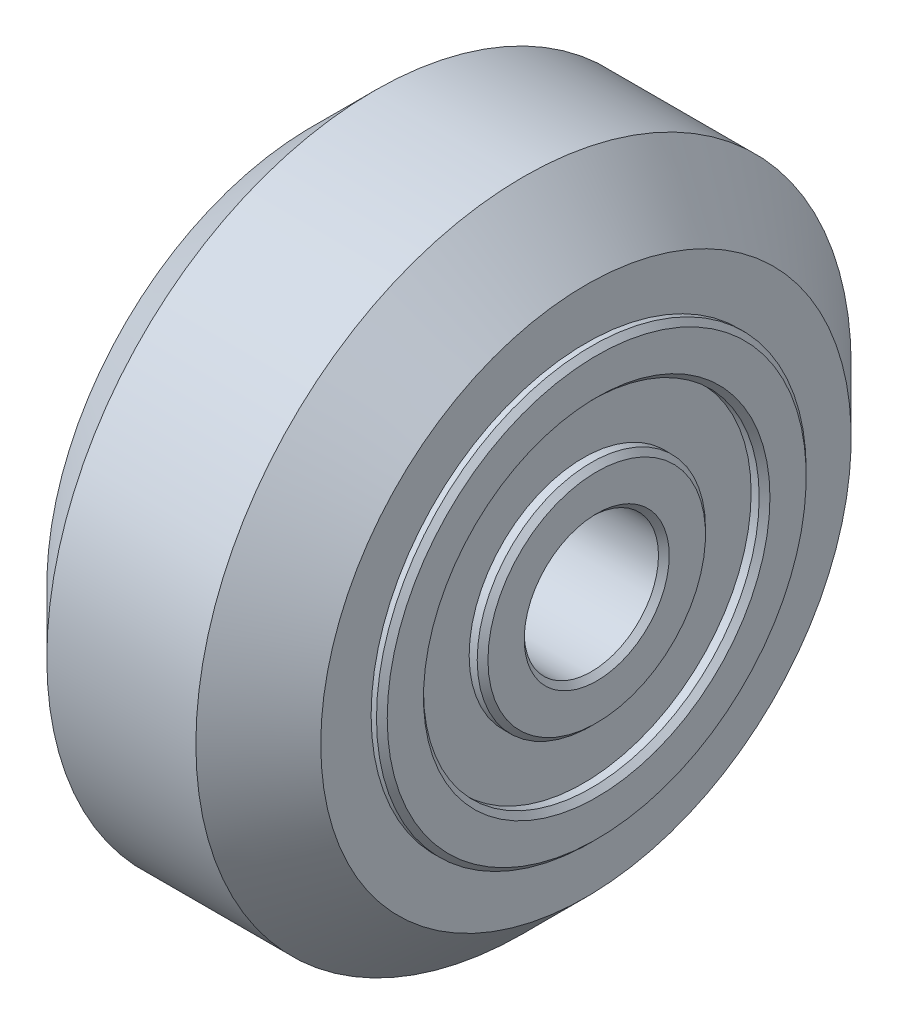
ISO-10303-21;
HEADER;
FILE_DESCRIPTION(('STEP AP214'),'2;1');
FILE_NAME('part.step','',(''),(''),'','','');
FILE_SCHEMA(('AUTOMOTIVE_DESIGN { 1 0 10303 214 1 1 1 1 }'));
ENDSEC;
DATA;
#1=APPLICATION_CONTEXT('core data for automotive mechanical design processes');
#2=APPLICATION_PROTOCOL_DEFINITION('international standard','automotive_design',2000,#1);
#3=PRODUCT_CONTEXT('',#1,'mechanical');
#4=PRODUCT('Part','Part','',(#3));
#5=PRODUCT_RELATED_PRODUCT_CATEGORY('part','',(#4));
#6=PRODUCT_DEFINITION_FORMATION('','',#4);
#7=PRODUCT_DEFINITION_CONTEXT('part definition',#1,'design');
#8=PRODUCT_DEFINITION('design','',#6,#7);
#9=PRODUCT_DEFINITION_SHAPE('','',#8);
#10=(LENGTH_UNIT() NAMED_UNIT(*) SI_UNIT(.MILLI.,.METRE.));
#11=(NAMED_UNIT(*) PLANE_ANGLE_UNIT() SI_UNIT($,.RADIAN.));
#12=(NAMED_UNIT(*) SI_UNIT($,.STERADIAN.) SOLID_ANGLE_UNIT());
#13=UNCERTAINTY_MEASURE_WITH_UNIT(LENGTH_MEASURE(1.E-05),#10,'distance_accuracy_value','');
#14=(GEOMETRIC_REPRESENTATION_CONTEXT(3) GLOBAL_UNCERTAINTY_ASSIGNED_CONTEXT((#13)) GLOBAL_UNIT_ASSIGNED_CONTEXT((#10,
#11,#12)) REPRESENTATION_CONTEXT('',''));
#15=CARTESIAN_POINT('',(0.,0.,0.));
#16=DIRECTION('',(0.,0.,1.));
#17=DIRECTION('',(1.,0.,0.));
#18=AXIS2_PLACEMENT_3D('',#15,#16,#17);
#19=CARTESIAN_POINT('',(0.,0.,0.));
#20=DIRECTION('',(1.,0.,0.));
#21=DIRECTION('',(0.,0.,-1.));
#22=AXIS2_PLACEMENT_3D('',#19,#20,#21);
#23=CYLINDRICAL_SURFACE('',#22,2.5);
#24=CARTESIAN_POINT('',(5.30000000003383,0.,0.));
#25=DIRECTION('',(1.,0.,0.));
#26=DIRECTION('',(0.,0.,-1.));
#27=AXIS2_PLACEMENT_3D('',#24,#25,#26);
#28=CIRCLE('',#27,2.49999999999773);
#29=CARTESIAN_POINT('',(5.30000000003383,0.,-2.49999999999773));
#30=VERTEX_POINT('',#29);
#31=EDGE_CURVE('P0_E52',#30,#30,#28,.T.);
#32=ORIENTED_EDGE('',*,*,#31,.T.);
#33=EDGE_LOOP('',(#32));
#34=FACE_BOUND('',#33,.T.);
#35=CARTESIAN_POINT('',(-5.29999999997699,0.,0.));
#36=DIRECTION('',(-1.,0.,0.));
#37=DIRECTION('',(0.,0.,1.));
#38=AXIS2_PLACEMENT_3D('',#35,#36,#37);
#39=CIRCLE('',#38,2.49999999999773);
#40=CARTESIAN_POINT('',(-5.29999999997699,0.,2.49999999999773));
#41=VERTEX_POINT('',#40);
#42=EDGE_CURVE('P0_E49',#41,#41,#39,.T.);
#43=ORIENTED_EDGE('',*,*,#42,.T.);
#44=EDGE_LOOP('',(#43));
#45=FACE_BOUND('',#44,.T.);
#46=ADVANCED_FACE('P0_F14',(#34,#45),#23,.F.);
#47=CARTESIAN_POINT('',(5.49999999998363,0.,0.));
#48=DIRECTION('',(1.,0.,0.));
#49=DIRECTION('',(0.,0.,-1.));
#50=AXIS2_PLACEMENT_3D('',#47,#48,#49);
#51=CONICAL_SURFACE('',#50,2.69999999994752,0.785398163397448);
#52=CARTESIAN_POINT('',(5.49999999998363,0.,0.));
#53=DIRECTION('',(1.,0.,0.));
#54=DIRECTION('',(0.,0.,-1.));
#55=AXIS2_PLACEMENT_3D('',#52,#53,#54);
#56=CIRCLE('',#55,2.69999999994752);
#57=CARTESIAN_POINT('',(5.49999999998363,0.,-2.69999999994752));
#58=VERTEX_POINT('',#57);
#59=EDGE_CURVE('P0_E17',#58,#58,#56,.F.);
#60=ORIENTED_EDGE('',*,*,#59,.F.);
#61=EDGE_LOOP('',(#60));
#62=FACE_BOUND('',#61,.T.);
#63=ORIENTED_EDGE('',*,*,#31,.F.);
#64=EDGE_LOOP('',(#63));
#65=FACE_BOUND('',#64,.T.);
#66=ADVANCED_FACE('P0_F89',(#62,#65),#51,.F.);
#67=CARTESIAN_POINT('',(-5.49999999992679,0.,0.));
#68=DIRECTION('',(-1.,0.,0.));
#69=DIRECTION('',(0.,0.,1.));
#70=AXIS2_PLACEMENT_3D('',#67,#68,#69);
#71=CONICAL_SURFACE('',#70,2.70000000000437,0.785398163539557);
#72=CARTESIAN_POINT('',(-5.49999999992679,0.,0.));
#73=DIRECTION('',(-1.,0.,0.));
#74=DIRECTION('',(0.,0.,1.));
#75=AXIS2_PLACEMENT_3D('',#72,#73,#74);
#76=CIRCLE('',#75,2.70000000000437);
#77=CARTESIAN_POINT('',(-5.49999999992679,0.,2.70000000000437));
#78=VERTEX_POINT('',#77);
#79=EDGE_CURVE('P0_E79',#78,#78,#76,.F.);
#80=ORIENTED_EDGE('',*,*,#79,.F.);
#81=EDGE_LOOP('',(#80));
#82=FACE_BOUND('',#81,.T.);
#83=ORIENTED_EDGE('',*,*,#42,.F.);
#84=EDGE_LOOP('',(#83));
#85=FACE_BOUND('',#84,.T.);
#86=ADVANCED_FACE('P0_F92',(#82,#85),#71,.F.);
#87=CARTESIAN_POINT('',(5.5,2.5,0.));
#88=DIRECTION('',(1.,0.,0.));
#89=DIRECTION('',(0.,0.,-1.));
#90=AXIS2_PLACEMENT_3D('',#87,#88,#89);
#91=PLANE('',#90);
#92=ORIENTED_EDGE('',*,*,#59,.T.);
#93=EDGE_LOOP('',(#92));
#94=FACE_BOUND('',#93,.T.);
#95=CARTESIAN_POINT('',(5.49999999998363,0.,0.));
#96=DIRECTION('',(-1.,0.,0.));
#97=DIRECTION('',(0.,0.,1.));
#98=AXIS2_PLACEMENT_3D('',#95,#96,#97);
#99=CIRCLE('',#98,4.05000000000655);
#100=CARTESIAN_POINT('',(5.49999999998363,0.,4.05000000000655));
#101=VERTEX_POINT('',#100);
#102=EDGE_CURVE('P0_E77',#101,#101,#99,.T.);
#103=ORIENTED_EDGE('',*,*,#102,.F.);
#104=EDGE_LOOP('',(#103));
#105=FACE_BOUND('',#104,.T.);
#106=ADVANCED_FACE('P0_F86',(#94,#105),#91,.T.);
#107=CARTESIAN_POINT('',(-5.5,2.5,0.));
#108=DIRECTION('',(-1.,0.,0.));
#109=DIRECTION('',(0.,0.,1.));
#110=AXIS2_PLACEMENT_3D('',#107,#108,#109);
#111=PLANE('',#110);
#112=ORIENTED_EDGE('',*,*,#79,.T.);
#113=EDGE_LOOP('',(#112));
#114=FACE_BOUND('',#113,.T.);
#115=CARTESIAN_POINT('',(-5.50000000004047,0.,0.));
#116=DIRECTION('',(1.,0.,0.));
#117=DIRECTION('',(0.,0.,-1.));
#118=AXIS2_PLACEMENT_3D('',#115,#116,#117);
#119=CIRCLE('',#118,4.05000000000655);
#120=CARTESIAN_POINT('',(-5.50000000004047,0.,-4.05000000000655));
#121=VERTEX_POINT('',#120);
#122=EDGE_CURVE('P0_E46',#121,#121,#119,.T.);
#123=ORIENTED_EDGE('',*,*,#122,.F.);
#124=EDGE_LOOP('',(#123));
#125=FACE_BOUND('',#124,.T.);
#126=ADVANCED_FACE('P0_F106',(#114,#125),#111,.T.);
#127=CARTESIAN_POINT('',(5.30000000009068,0.,0.));
#128=DIRECTION('',(-1.,0.,0.));
#129=DIRECTION('',(0.,0.,1.));
#130=AXIS2_PLACEMENT_3D('',#127,#128,#129);
#131=CONICAL_SURFACE('',#130,4.24999999995634,0.785398163539557);
#132=ORIENTED_EDGE('',*,*,#102,.T.);
#133=EDGE_LOOP('',(#132));
#134=FACE_BOUND('',#133,.T.);
#135=CARTESIAN_POINT('',(5.3,0.,0.));
#136=DIRECTION('',(1.,0.,0.));
#137=DIRECTION('',(0.,0.,-1.));
#138=AXIS2_PLACEMENT_3D('',#135,#136,#137);
#139=CIRCLE('',#138,4.25);
#140=CARTESIAN_POINT('',(5.3,0.,-4.25));
#141=VERTEX_POINT('',#140);
#142=EDGE_CURVE('P0_E43',#141,#141,#139,.F.);
#143=ORIENTED_EDGE('',*,*,#142,.F.);
#144=EDGE_LOOP('',(#143));
#145=FACE_BOUND('',#144,.T.);
#146=ADVANCED_FACE('P0_F166',(#134,#145),#131,.T.);
#147=CARTESIAN_POINT('',(-5.29999999997699,0.,0.));
#148=DIRECTION('',(1.,0.,0.));
#149=DIRECTION('',(0.,0.,-1.));
#150=AXIS2_PLACEMENT_3D('',#147,#148,#149);
#151=CONICAL_SURFACE('',#150,4.25000000007003,0.785398163397448);
#152=ORIENTED_EDGE('',*,*,#122,.T.);
#153=EDGE_LOOP('',(#152));
#154=FACE_BOUND('',#153,.T.);
#155=CARTESIAN_POINT('',(-5.3,0.,0.));
#156=DIRECTION('',(1.,0.,0.));
#157=DIRECTION('',(0.,0.,-1.));
#158=AXIS2_PLACEMENT_3D('',#155,#156,#157);
#159=CIRCLE('',#158,4.25);
#160=CARTESIAN_POINT('',(-5.3,0.,-4.25));
#161=VERTEX_POINT('',#160);
#162=EDGE_CURVE('P0_E39',#161,#161,#159,.T.);
#163=ORIENTED_EDGE('',*,*,#162,.F.);
#164=EDGE_LOOP('',(#163));
#165=FACE_BOUND('',#164,.T.);
#166=ADVANCED_FACE('P0_F162',(#154,#165),#151,.T.);
#167=CARTESIAN_POINT('',(0.,0.,0.));
#168=DIRECTION('',(1.,0.,0.));
#169=DIRECTION('',(0.,0.,-1.));
#170=AXIS2_PLACEMENT_3D('',#167,#168,#169);
#171=CYLINDRICAL_SURFACE('',#170,4.25);
#172=CARTESIAN_POINT('',(5.,0.,0.));
#173=DIRECTION('',(1.,0.,0.));
#174=DIRECTION('',(0.,0.,-1.));
#175=AXIS2_PLACEMENT_3D('',#172,#173,#174);
#176=CIRCLE('',#175,4.25);
#177=CARTESIAN_POINT('',(5.,0.,-4.25));
#178=VERTEX_POINT('',#177);
#179=EDGE_CURVE('P0_E42',#178,#178,#176,.F.);
#180=ORIENTED_EDGE('',*,*,#179,.F.);
#181=EDGE_LOOP('',(#180));
#182=FACE_BOUND('',#181,.T.);
#183=ORIENTED_EDGE('',*,*,#142,.T.);
#184=EDGE_LOOP('',(#183));
#185=FACE_BOUND('',#184,.T.);
#186=ADVANCED_FACE('P0_F158',(#182,#185),#171,.T.);
#187=CARTESIAN_POINT('',(0.,0.,0.));
#188=DIRECTION('',(1.,0.,0.));
#189=DIRECTION('',(0.,0.,-1.));
#190=AXIS2_PLACEMENT_3D('',#187,#188,#189);
#191=CYLINDRICAL_SURFACE('',#190,4.25);
#192=ORIENTED_EDGE('',*,*,#162,.T.);
#193=EDGE_LOOP('',(#192));
#194=FACE_BOUND('',#193,.T.);
#195=CARTESIAN_POINT('',(-5.,0.,0.));
#196=DIRECTION('',(1.,0.,0.));
#197=DIRECTION('',(0.,0.,-1.));
#198=AXIS2_PLACEMENT_3D('',#195,#196,#197);
#199=CIRCLE('',#198,4.25);
#200=CARTESIAN_POINT('',(-5.,0.,-4.25));
#201=VERTEX_POINT('',#200);
#202=EDGE_CURVE('P0_E70',#201,#201,#199,.T.);
#203=ORIENTED_EDGE('',*,*,#202,.F.);
#204=EDGE_LOOP('',(#203));
#205=FACE_BOUND('',#204,.T.);
#206=ADVANCED_FACE('P0_F154',(#194,#205),#191,.T.);
#207=CARTESIAN_POINT('',(5.,4.25,0.));
#208=DIRECTION('',(1.,0.,0.));
#209=DIRECTION('',(0.,0.,-1.));
#210=AXIS2_PLACEMENT_3D('',#207,#208,#209);
#211=PLANE('',#210);
#212=ORIENTED_EDGE('',*,*,#179,.T.);
#213=EDGE_LOOP('',(#212));
#214=FACE_BOUND('',#213,.T.);
#215=CARTESIAN_POINT('',(5.,0.,0.));
#216=DIRECTION('',(1.,0.,0.));
#217=DIRECTION('',(0.,0.,-1.));
#218=AXIS2_PLACEMENT_3D('',#215,#216,#217);
#219=CIRCLE('',#218,6.25);
#220=CARTESIAN_POINT('',(5.,0.,-6.25));
#221=VERTEX_POINT('',#220);
#222=EDGE_CURVE('P0_E67',#221,#221,#219,.T.);
#223=ORIENTED_EDGE('',*,*,#222,.T.);
#224=EDGE_LOOP('',(#223));
#225=FACE_BOUND('',#224,.T.);
#226=ADVANCED_FACE('P0_F150',(#214,#225),#211,.T.);
#227=CARTESIAN_POINT('',(-5.,4.25,0.));
#228=DIRECTION('',(-1.,0.,0.));
#229=DIRECTION('',(0.,0.,1.));
#230=AXIS2_PLACEMENT_3D('',#227,#228,#229);
#231=PLANE('',#230);
#232=ORIENTED_EDGE('',*,*,#202,.T.);
#233=EDGE_LOOP('',(#232));
#234=FACE_BOUND('',#233,.T.);
#235=CARTESIAN_POINT('',(-5.,0.,0.));
#236=DIRECTION('',(1.,0.,0.));
#237=DIRECTION('',(0.,0.,-1.));
#238=AXIS2_PLACEMENT_3D('',#235,#236,#237);
#239=CIRCLE('',#238,6.25);
#240=CARTESIAN_POINT('',(-5.,0.,-6.25));
#241=VERTEX_POINT('',#240);
#242=EDGE_CURVE('P0_E38',#241,#241,#239,.F.);
#243=ORIENTED_EDGE('',*,*,#242,.T.);
#244=EDGE_LOOP('',(#243));
#245=FACE_BOUND('',#244,.T.);
#246=ADVANCED_FACE('P0_F146',(#234,#245),#231,.T.);
#247=CARTESIAN_POINT('',(0.,0.,0.));
#248=DIRECTION('',(1.,0.,0.));
#249=DIRECTION('',(0.,0.,-1.));
#250=AXIS2_PLACEMENT_3D('',#247,#248,#249);
#251=CYLINDRICAL_SURFACE('',#250,6.25);
#252=CARTESIAN_POINT('',(5.29999999992015,0.,0.));
#253=DIRECTION('',(1.,0.,0.));
#254=DIRECTION('',(0.,0.,-1.));
#255=AXIS2_PLACEMENT_3D('',#252,#253,#254);
#256=CIRCLE('',#255,6.25000000002274);
#257=CARTESIAN_POINT('',(5.29999999992015,0.,-6.25000000002274));
#258=VERTEX_POINT('',#257);
#259=EDGE_CURVE('P0_E35',#258,#258,#256,.T.);
#260=ORIENTED_EDGE('',*,*,#259,.T.);
#261=EDGE_LOOP('',(#260));
#262=FACE_BOUND('',#261,.T.);
#263=ORIENTED_EDGE('',*,*,#222,.F.);
#264=EDGE_LOOP('',(#263));
#265=FACE_BOUND('',#264,.T.);
#266=ADVANCED_FACE('P0_F142',(#262,#265),#251,.F.);
#267=CARTESIAN_POINT('',(0.,0.,0.));
#268=DIRECTION('',(1.,0.,0.));
#269=DIRECTION('',(0.,0.,-1.));
#270=AXIS2_PLACEMENT_3D('',#267,#268,#269);
#271=CYLINDRICAL_SURFACE('',#270,6.25);
#272=ORIENTED_EDGE('',*,*,#242,.F.);
#273=EDGE_LOOP('',(#272));
#274=FACE_BOUND('',#273,.T.);
#275=CARTESIAN_POINT('',(-5.30000000003383,0.,0.));
#276=DIRECTION('',(-1.,0.,0.));
#277=DIRECTION('',(0.,0.,1.));
#278=AXIS2_PLACEMENT_3D('',#275,#276,#277);
#279=CIRCLE('',#278,6.25000000002274);
#280=CARTESIAN_POINT('',(-5.30000000003383,0.,6.25000000002274));
#281=VERTEX_POINT('',#280);
#282=EDGE_CURVE('P0_E31',#281,#281,#279,.T.);
#283=ORIENTED_EDGE('',*,*,#282,.T.);
#284=EDGE_LOOP('',(#283));
#285=FACE_BOUND('',#284,.T.);
#286=ADVANCED_FACE('P0_F138',(#274,#285),#271,.F.);
#287=CARTESIAN_POINT('',(5.49999999998363,0.,0.));
#288=DIRECTION('',(1.,0.,0.));
#289=DIRECTION('',(0.,0.,-1.));
#290=AXIS2_PLACEMENT_3D('',#287,#288,#289);
#291=CONICAL_SURFACE('',#290,6.45000000008622,0.785398163397448);
#292=CARTESIAN_POINT('',(5.49999999998363,0.,0.));
#293=DIRECTION('',(1.,0.,0.));
#294=DIRECTION('',(0.,0.,-1.));
#295=AXIS2_PLACEMENT_3D('',#292,#293,#294);
#296=CIRCLE('',#295,6.45000000008622);
#297=CARTESIAN_POINT('',(5.49999999998363,0.,-6.45000000008622));
#298=VERTEX_POINT('',#297);
#299=EDGE_CURVE('P0_E34',#298,#298,#296,.F.);
#300=ORIENTED_EDGE('',*,*,#299,.F.);
#301=EDGE_LOOP('',(#300));
#302=FACE_BOUND('',#301,.T.);
#303=ORIENTED_EDGE('',*,*,#259,.F.);
#304=EDGE_LOOP('',(#303));
#305=FACE_BOUND('',#304,.T.);
#306=ADVANCED_FACE('P0_F134',(#302,#305),#291,.F.);
#307=CARTESIAN_POINT('',(-5.49999999992679,0.,0.));
#308=DIRECTION('',(-1.,0.,0.));
#309=DIRECTION('',(0.,0.,1.));
#310=AXIS2_PLACEMENT_3D('',#307,#308,#309);
#311=CONICAL_SURFACE('',#310,6.44999999985885,0.785398163397448);
#312=CARTESIAN_POINT('',(-5.49999999998363,0.,0.));
#313=DIRECTION('',(-1.,0.,0.));
#314=DIRECTION('',(0.,0.,1.));
#315=AXIS2_PLACEMENT_3D('',#312,#313,#314);
#316=CIRCLE('',#315,6.44999999991569);
#317=CARTESIAN_POINT('',(-5.49999999998363,0.,6.44999999991569));
#318=VERTEX_POINT('',#317);
#319=EDGE_CURVE('P0_E60',#318,#318,#316,.F.);
#320=ORIENTED_EDGE('',*,*,#319,.F.);
#321=EDGE_LOOP('',(#320));
#322=FACE_BOUND('',#321,.T.);
#323=ORIENTED_EDGE('',*,*,#282,.F.);
#324=EDGE_LOOP('',(#323));
#325=FACE_BOUND('',#324,.T.);
#326=ADVANCED_FACE('P0_F130',(#322,#325),#311,.F.);
#327=CARTESIAN_POINT('',(5.5,6.25,0.));
#328=DIRECTION('',(1.,0.,0.));
#329=DIRECTION('',(0.,0.,-1.));
#330=AXIS2_PLACEMENT_3D('',#327,#328,#329);
#331=PLANE('',#330);
#332=ORIENTED_EDGE('',*,*,#299,.T.);
#333=EDGE_LOOP('',(#332));
#334=FACE_BOUND('',#333,.T.);
#335=CARTESIAN_POINT('',(5.5,0.,0.));
#336=DIRECTION('',(-1.,0.,0.));
#337=DIRECTION('',(0.,0.,1.));
#338=AXIS2_PLACEMENT_3D('',#335,#336,#337);
#339=CIRCLE('',#338,7.8);
#340=CARTESIAN_POINT('',(5.5,0.,7.8));
#341=VERTEX_POINT('',#340);
#342=EDGE_CURVE('P0_E57',#341,#341,#339,.T.);
#343=ORIENTED_EDGE('',*,*,#342,.F.);
#344=EDGE_LOOP('',(#343));
#345=FACE_BOUND('',#344,.T.);
#346=ADVANCED_FACE('P0_F126',(#334,#345),#331,.T.);
#347=CARTESIAN_POINT('',(-5.5,6.25,0.));
#348=DIRECTION('',(-1.,0.,0.));
#349=DIRECTION('',(0.,0.,1.));
#350=AXIS2_PLACEMENT_3D('',#347,#348,#349);
#351=PLANE('',#350);
#352=ORIENTED_EDGE('',*,*,#319,.T.);
#353=EDGE_LOOP('',(#352));
#354=FACE_BOUND('',#353,.T.);
#355=CARTESIAN_POINT('',(-5.5,0.,0.));
#356=DIRECTION('',(1.,0.,0.));
#357=DIRECTION('',(0.,0.,-1.));
#358=AXIS2_PLACEMENT_3D('',#355,#356,#357);
#359=CIRCLE('',#358,7.8);
#360=CARTESIAN_POINT('',(-5.5,0.,-7.8));
#361=VERTEX_POINT('',#360);
#362=EDGE_CURVE('P0_E26',#361,#361,#359,.T.);
#363=ORIENTED_EDGE('',*,*,#362,.F.);
#364=EDGE_LOOP('',(#363));
#365=FACE_BOUND('',#364,.T.);
#366=ADVANCED_FACE('P0_F122',(#354,#365),#351,.T.);
#367=CARTESIAN_POINT('',(5.3,0.,0.));
#368=DIRECTION('',(-1.,0.,0.));
#369=DIRECTION('',(0.,0.,1.));
#370=AXIS2_PLACEMENT_3D('',#367,#368,#369);
#371=CONICAL_SURFACE('',#370,8.,0.785398163397457);
#372=ORIENTED_EDGE('',*,*,#342,.T.);
#373=EDGE_LOOP('',(#372));
#374=FACE_BOUND('',#373,.T.);
#375=CARTESIAN_POINT('',(5.3,0.,0.));
#376=DIRECTION('',(1.,0.,0.));
#377=DIRECTION('',(0.,0.,-1.));
#378=AXIS2_PLACEMENT_3D('',#375,#376,#377);
#379=CIRCLE('',#378,8.);
#380=CARTESIAN_POINT('',(5.3,0.,-8.));
#381=VERTEX_POINT('',#380);
#382=EDGE_CURVE('P0_E21',#381,#381,#379,.F.);
#383=ORIENTED_EDGE('',*,*,#382,.F.);
#384=EDGE_LOOP('',(#383));
#385=FACE_BOUND('',#384,.T.);
#386=ADVANCED_FACE('P0_F115',(#374,#385),#371,.T.);
#387=CARTESIAN_POINT('',(-5.3,0.,0.));
#388=DIRECTION('',(1.,0.,0.));
#389=DIRECTION('',(0.,0.,-1.));
#390=AXIS2_PLACEMENT_3D('',#387,#388,#389);
#391=CONICAL_SURFACE('',#390,8.,0.785398163397459);
#392=ORIENTED_EDGE('',*,*,#362,.T.);
#393=EDGE_LOOP('',(#392));
#394=FACE_BOUND('',#393,.T.);
#395=CARTESIAN_POINT('',(-5.3,0.,0.));
#396=DIRECTION('',(1.,0.,0.));
#397=DIRECTION('',(0.,0.,-1.));
#398=AXIS2_PLACEMENT_3D('',#395,#396,#397);
#399=CIRCLE('',#398,8.);
#400=CARTESIAN_POINT('',(-5.3,0.,-8.));
#401=VERTEX_POINT('',#400);
#402=EDGE_CURVE('P0_E9',#401,#401,#399,.T.);
#403=ORIENTED_EDGE('',*,*,#402,.F.);
#404=EDGE_LOOP('',(#403));
#405=FACE_BOUND('',#404,.T.);
#406=ADVANCED_FACE('P0_F110',(#394,#405),#391,.T.);
#407=CARTESIAN_POINT('',(0.,0.,0.));
#408=DIRECTION('',(1.,0.,0.));
#409=DIRECTION('',(0.,0.,-1.));
#410=AXIS2_PLACEMENT_3D('',#407,#408,#409);
#411=CYLINDRICAL_SURFACE('',#410,8.);
#412=ORIENTED_EDGE('',*,*,#402,.T.);
#413=EDGE_LOOP('',(#412));
#414=FACE_BOUND('',#413,.T.);
#415=ORIENTED_EDGE('',*,*,#382,.T.);
#416=EDGE_LOOP('',(#415));
#417=FACE_BOUND('',#416,.T.);
#418=ADVANCED_FACE('P0_F108',(#414,#417),#411,.T.);
#419=CLOSED_SHELL('',(#46,#66,#86,#106,#126,#146,#166,#186,#206,#226,#246,#266,#286,#306,#326,
#346,#366,#386,#406,#418));
#420=MANIFOLD_SOLID_BREP('P0_B1',#419);
#421=CARTESIAN_POINT('',(0.,0.,0.));
#422=DIRECTION('',(-1.,0.,0.));
#423=DIRECTION('',(0.,0.,1.));
#424=AXIS2_PLACEMENT_3D('',#421,#422,#423);
#425=CYLINDRICAL_SURFACE('',#424,12.2);
#426=CARTESIAN_POINT('',(2.775,0.,0.));
#427=DIRECTION('',(-1.,0.,0.));
#428=DIRECTION('',(0.,0.,1.));
#429=AXIS2_PLACEMENT_3D('',#426,#427,#428);
#430=CIRCLE('',#429,12.2);
#431=CARTESIAN_POINT('',(2.775,0.,12.2));
#432=VERTEX_POINT('',#431);
#433=EDGE_CURVE('P1_E35',#432,#432,#430,.F.);
#434=ORIENTED_EDGE('',*,*,#433,.F.);
#435=EDGE_LOOP('',(#434));
#436=FACE_BOUND('',#435,.T.);
#437=CARTESIAN_POINT('',(-2.775,0.,0.));
#438=DIRECTION('',(1.,0.,0.));
#439=DIRECTION('',(0.,0.,-1.));
#440=AXIS2_PLACEMENT_3D('',#437,#438,#439);
#441=CIRCLE('',#440,12.2);
#442=CARTESIAN_POINT('',(-2.775,0.,-12.2));
#443=VERTEX_POINT('',#442);
#444=EDGE_CURVE('P1_E29',#443,#443,#441,.F.);
#445=ORIENTED_EDGE('',*,*,#444,.F.);
#446=EDGE_LOOP('',(#445));
#447=FACE_BOUND('',#446,.T.);
#448=ADVANCED_FACE('P1_F14',(#436,#447),#425,.T.);
#449=CARTESIAN_POINT('',(-2.775,0.,0.));
#450=DIRECTION('',(1.,0.,0.));
#451=DIRECTION('',(0.,0.,-1.));
#452=AXIS2_PLACEMENT_3D('',#449,#450,#451);
#453=CONICAL_SURFACE('',#452,12.2,0.78539816339745);
#454=CARTESIAN_POINT('',(-5.1,0.,0.));
#455=DIRECTION('',(1.,0.,0.));
#456=DIRECTION('',(0.,0.,-1.));
#457=AXIS2_PLACEMENT_3D('',#454,#455,#456);
#458=CIRCLE('',#457,9.87499999999999);
#459=CARTESIAN_POINT('',(-5.1,0.,-9.87499999999999));
#460=VERTEX_POINT('',#459);
#461=EDGE_CURVE('P1_E17',#460,#460,#458,.T.);
#462=ORIENTED_EDGE('',*,*,#461,.T.);
#463=EDGE_LOOP('',(#462));
#464=FACE_BOUND('',#463,.T.);
#465=ORIENTED_EDGE('',*,*,#444,.T.);
#466=EDGE_LOOP('',(#465));
#467=FACE_BOUND('',#466,.T.);
#468=ADVANCED_FACE('P1_F44',(#464,#467),#453,.T.);
#469=CARTESIAN_POINT('',(2.775,0.,0.));
#470=DIRECTION('',(-1.,0.,0.));
#471=DIRECTION('',(0.,0.,1.));
#472=AXIS2_PLACEMENT_3D('',#469,#470,#471);
#473=CONICAL_SURFACE('',#472,12.2,0.785398163397449);
#474=CARTESIAN_POINT('',(5.1,0.,0.));
#475=DIRECTION('',(-1.,0.,0.));
#476=DIRECTION('',(0.,0.,1.));
#477=AXIS2_PLACEMENT_3D('',#474,#475,#476);
#478=CIRCLE('',#477,9.87499999999999);
#479=CARTESIAN_POINT('',(5.1,0.,9.87499999999999));
#480=VERTEX_POINT('',#479);
#481=EDGE_CURVE('P1_E26',#480,#480,#478,.F.);
#482=ORIENTED_EDGE('',*,*,#481,.F.);
#483=EDGE_LOOP('',(#482));
#484=FACE_BOUND('',#483,.T.);
#485=ORIENTED_EDGE('',*,*,#433,.T.);
#486=EDGE_LOOP('',(#485));
#487=FACE_BOUND('',#486,.T.);
#488=ADVANCED_FACE('P1_F52',(#484,#487),#473,.T.);
#489=CARTESIAN_POINT('',(-5.1,0.,0.));
#490=DIRECTION('',(1.,0.,0.));
#491=DIRECTION('',(0.,0.,-1.));
#492=AXIS2_PLACEMENT_3D('',#489,#490,#491);
#493=PLANE('',#492);
#494=CARTESIAN_POINT('',(-5.1,0.,0.));
#495=DIRECTION('',(-1.,0.,0.));
#496=DIRECTION('',(0.,0.,1.));
#497=AXIS2_PLACEMENT_3D('',#494,#495,#496);
#498=CIRCLE('',#497,8.);
#499=CARTESIAN_POINT('',(-5.1,0.,8.));
#500=VERTEX_POINT('',#499);
#501=EDGE_CURVE('P1_E21',#500,#500,#498,.F.);
#502=ORIENTED_EDGE('',*,*,#501,.T.);
#503=EDGE_LOOP('',(#502));
#504=FACE_BOUND('',#503,.T.);
#505=ORIENTED_EDGE('',*,*,#461,.F.);
#506=EDGE_LOOP('',(#505));
#507=FACE_BOUND('',#506,.T.);
#508=ADVANCED_FACE('P1_F61',(#504,#507),#493,.F.);
#509=CARTESIAN_POINT('',(5.1,0.,0.));
#510=DIRECTION('',(1.,0.,0.));
#511=DIRECTION('',(0.,0.,-1.));
#512=AXIS2_PLACEMENT_3D('',#509,#510,#511);
#513=PLANE('',#512);
#514=CARTESIAN_POINT('',(5.1,0.,0.));
#515=DIRECTION('',(-1.,0.,0.));
#516=DIRECTION('',(0.,0.,1.));
#517=AXIS2_PLACEMENT_3D('',#514,#515,#516);
#518=CIRCLE('',#517,8.);
#519=CARTESIAN_POINT('',(5.1,0.,8.));
#520=VERTEX_POINT('',#519);
#521=EDGE_CURVE('P1_E9',#520,#520,#518,.T.);
#522=ORIENTED_EDGE('',*,*,#521,.T.);
#523=EDGE_LOOP('',(#522));
#524=FACE_BOUND('',#523,.T.);
#525=ORIENTED_EDGE('',*,*,#481,.T.);
#526=EDGE_LOOP('',(#525));
#527=FACE_BOUND('',#526,.T.);
#528=ADVANCED_FACE('P1_F55',(#524,#527),#513,.T.);
#529=CARTESIAN_POINT('',(0.,0.,0.));
#530=DIRECTION('',(-1.,0.,0.));
#531=DIRECTION('',(0.,0.,1.));
#532=AXIS2_PLACEMENT_3D('',#529,#530,#531);
#533=CYLINDRICAL_SURFACE('',#532,8.);
#534=ORIENTED_EDGE('',*,*,#501,.F.);
#535=EDGE_LOOP('',(#534));
#536=FACE_BOUND('',#535,.T.);
#537=ORIENTED_EDGE('',*,*,#521,.F.);
#538=EDGE_LOOP('',(#537));
#539=FACE_BOUND('',#538,.T.);
#540=ADVANCED_FACE('P1_F53',(#536,#539),#533,.F.);
#541=CLOSED_SHELL('',(#448,#468,#488,#508,#528,#540));
#542=MANIFOLD_SOLID_BREP('P1_B1',#541);
#543=ADVANCED_BREP_SHAPE_REPRESENTATION('',(#18,#420,#542),#14);
#544=SHAPE_DEFINITION_REPRESENTATION(#9,#543);
ENDSEC;
END-ISO-10303-21;
